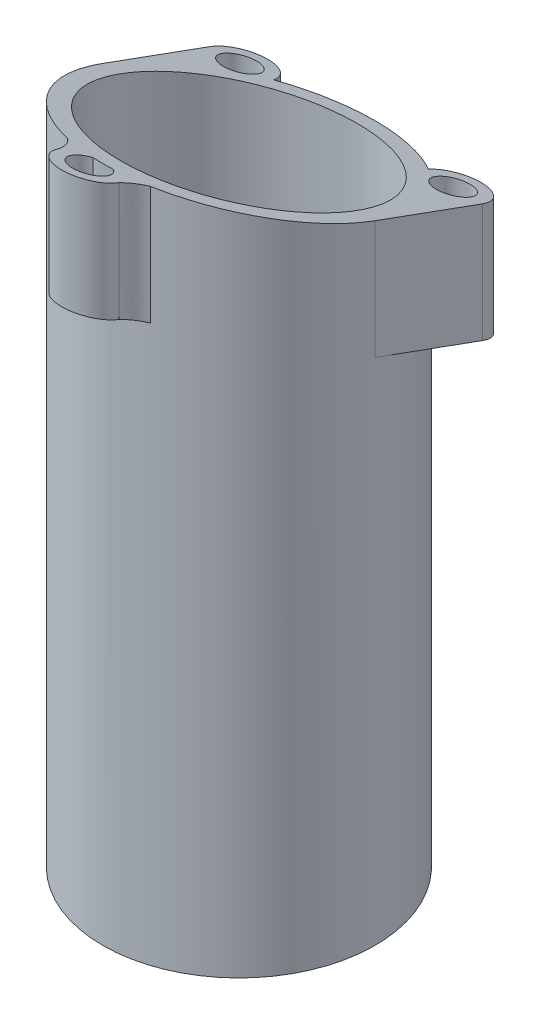
ISO-10303-21;
HEADER;
FILE_DESCRIPTION(('STEP AP214'),'2;1');
FILE_NAME('part.step','',(''),(''),'','','');
FILE_SCHEMA(('AUTOMOTIVE_DESIGN { 1 0 10303 214 1 1 1 1 }'));
ENDSEC;
DATA;
#1=APPLICATION_CONTEXT('core data for automotive mechanical design processes');
#2=APPLICATION_PROTOCOL_DEFINITION('international standard','automotive_design',2000,#1);
#3=PRODUCT_CONTEXT('',#1,'mechanical');
#4=PRODUCT('Part','Part','',(#3));
#5=PRODUCT_RELATED_PRODUCT_CATEGORY('part','',(#4));
#6=PRODUCT_DEFINITION_FORMATION('','',#4);
#7=PRODUCT_DEFINITION_CONTEXT('part definition',#1,'design');
#8=PRODUCT_DEFINITION('design','',#6,#7);
#9=PRODUCT_DEFINITION_SHAPE('','',#8);
#10=(LENGTH_UNIT() NAMED_UNIT(*) SI_UNIT(.MILLI.,.METRE.));
#11=(NAMED_UNIT(*) PLANE_ANGLE_UNIT() SI_UNIT($,.RADIAN.));
#12=(NAMED_UNIT(*) SI_UNIT($,.STERADIAN.) SOLID_ANGLE_UNIT());
#13=UNCERTAINTY_MEASURE_WITH_UNIT(LENGTH_MEASURE(1.E-05),#10,'distance_accuracy_value','');
#14=(GEOMETRIC_REPRESENTATION_CONTEXT(3) GLOBAL_UNCERTAINTY_ASSIGNED_CONTEXT((#13)) GLOBAL_UNIT_ASSIGNED_CONTEXT((#10,
#11,#12)) REPRESENTATION_CONTEXT('',''));
#15=CARTESIAN_POINT('',(0.,0.,0.));
#16=DIRECTION('',(0.,0.,1.));
#17=DIRECTION('',(1.,0.,0.));
#18=AXIS2_PLACEMENT_3D('',#15,#16,#17);
#19=CARTESIAN_POINT('',(0.,-57.18,0.));
#20=DIRECTION('',(0.,1.,0.));
#21=DIRECTION('',(0.,0.,1.));
#22=AXIS2_PLACEMENT_3D('',#19,#20,#21);
#23=CYLINDRICAL_SURFACE('',#22,11.5);
#24=DIRECTION('',(0.,1.,0.));
#25=VECTOR('',#24,1.);
#26=CARTESIAN_POINT('',(-0.861512026318653,-10.0117617335204,11.467684902739));
#27=LINE('',#26,#25);
#28=CARTESIAN_POINT('',(-0.861512026318653,-10.0117617335204,11.467684902739));
#29=VERTEX_POINT('',#28);
#30=CARTESIAN_POINT('',(-0.861512026318653,-0.0117617335204157,11.467684902739));
#31=VERTEX_POINT('',#30);
#32=EDGE_CURVE('E331',#29,#31,#27,.T.);
#33=ORIENTED_EDGE('',*,*,#32,.F.);
#34=CARTESIAN_POINT('',(0.,-14.1856576940613,0.));
#35=DIRECTION('',(0.,0.93969262078591,-0.342020143325666));
#36=DIRECTION('',(0.,0.342020143325666,0.93969262078591));
#37=AXIS2_PLACEMENT_3D('',#34,#35,#36);
#38=ELLIPSE('',#37,12.238044383473,11.5);
#39=CARTESIAN_POINT('',(-3.50666135712482,-10.1993390061462,10.9523205817967));
#40=VERTEX_POINT('',#39);
#41=EDGE_CURVE('E321',#40,#29,#38,.T.);
#42=ORIENTED_EDGE('',*,*,#41,.F.);
#43=DIRECTION('',(0.,1.,0.));
#44=VECTOR('',#43,1.);
#45=CARTESIAN_POINT('',(-3.50666135712482,-10.1993390061462,10.9523205817967));
#46=LINE('',#45,#44);
#47=CARTESIAN_POINT('',(-3.50666135712482,-0.199339006146233,10.9523205817967));
#48=VERTEX_POINT('',#47);
#49=EDGE_CURVE('E259',#40,#48,#46,.T.);
#50=ORIENTED_EDGE('',*,*,#49,.T.);
#51=CARTESIAN_POINT('',(0.,-4.18565769406128,0.));
#52=DIRECTION('',(0.,-0.93969262078591,0.342020143325666));
#53=DIRECTION('',(0.,0.342020143325666,0.93969262078591));
#54=AXIS2_PLACEMENT_3D('',#51,#52,#53);
#55=ELLIPSE('',#54,12.238044383473,11.5);
#56=CARTESIAN_POINT('',(-11.5,-4.18565769406128,0.));
#57=VERTEX_POINT('',#56);
#58=EDGE_CURVE('E277',#57,#48,#55,.F.);
#59=ORIENTED_EDGE('',*,*,#58,.F.);
#60=DIRECTION('',(0.,1.,0.));
#61=VECTOR('',#60,1.);
#62=CARTESIAN_POINT('',(-11.5,-14.1856576940613,0.));
#63=LINE('',#62,#61);
#64=CARTESIAN_POINT('',(-11.5,-14.1856576940613,0.));
#65=VERTEX_POINT('',#64);
#66=EDGE_CURVE('E267',#65,#57,#63,.T.);
#67=ORIENTED_EDGE('',*,*,#66,.F.);
#68=CARTESIAN_POINT('',(0.,-14.1856576940613,0.));
#69=DIRECTION('',(0.,0.93969262078591,-0.342020143325666));
#70=DIRECTION('',(0.,0.342020143325666,0.93969262078591));
#71=AXIS2_PLACEMENT_3D('',#68,#69,#70);
#72=ELLIPSE('',#71,12.238044383473,11.5);
#73=CARTESIAN_POINT('',(-8.48621225649061,-17.0104560192602,-7.76106961299746));
#74=VERTEX_POINT('',#73);
#75=EDGE_CURVE('E251',#74,#65,#72,.T.);
#76=ORIENTED_EDGE('',*,*,#75,.F.);
#77=CARTESIAN_POINT('',(0.,-14.1856576940613,0.));
#78=DIRECTION('',(0.,0.93969262078591,-0.342020143325666));
#79=DIRECTION('',(0.,0.342020143325665,0.93969262078591));
#80=AXIS2_PLACEMENT_3D('',#77,#78,#79);
#81=ELLIPSE('',#80,12.238044383473,11.5);
#82=CARTESIAN_POINT('',(-7.57129556332708,-17.3361661185708,-8.65595075614149));
#83=VERTEX_POINT('',#82);
#84=EDGE_CURVE('E154',#74,#83,#81,.F.);
#85=ORIENTED_EDGE('',*,*,#84,.T.);
#86=CARTESIAN_POINT('',(-6.53274349604438,-17.6303867186112,-9.46431521109095));
#87=VERTEX_POINT('',#86);
#88=EDGE_CURVE('E266',#87,#83,#72,.T.);
#89=ORIENTED_EDGE('',*,*,#88,.F.);
#90=DIRECTION('',(0.,1.,0.));
#91=VECTOR('',#90,1.);
#92=CARTESIAN_POINT('',(-6.53274349604438,-17.6303867186112,-9.46431521109095));
#93=LINE('',#92,#91);
#94=CARTESIAN_POINT('',(-6.53274349604438,-7.6303867186112,-9.46431521109095));
#95=VERTEX_POINT('',#94);
#96=EDGE_CURVE('E250',#87,#95,#93,.T.);
#97=ORIENTED_EDGE('',*,*,#96,.T.);
#98=CARTESIAN_POINT('',(6.53274349604437,-7.63038671861125,-9.46431521109108));
#99=VERTEX_POINT('',#98);
#100=EDGE_CURVE('E282',#99,#95,#55,.F.);
#101=ORIENTED_EDGE('',*,*,#100,.F.);
#102=DIRECTION('',(0.,1.,0.));
#103=VECTOR('',#102,1.);
#104=CARTESIAN_POINT('',(6.53274349604431,-17.6303867186112,-9.46431521109097));
#105=LINE('',#104,#103);
#106=CARTESIAN_POINT('',(6.53274349604431,-17.6303867186112,-9.46431521109097));
#107=VERTEX_POINT('',#106);
#108=EDGE_CURVE('E176',#107,#99,#105,.T.);
#109=ORIENTED_EDGE('',*,*,#108,.F.);
#110=CARTESIAN_POINT('',(0.,-14.1856576940613,0.));
#111=DIRECTION('',(0.,0.93969262078591,-0.342020143325666));
#112=DIRECTION('',(0.,0.342020143325666,0.93969262078591));
#113=AXIS2_PLACEMENT_3D('',#110,#111,#112);
#114=ELLIPSE('',#113,12.238044383473,11.5);
#115=CARTESIAN_POINT('',(7.57129556332706,-17.3361661185708,-8.65595075614156));
#116=VERTEX_POINT('',#115);
#117=EDGE_CURVE('E167',#116,#107,#114,.T.);
#118=ORIENTED_EDGE('',*,*,#117,.F.);
#119=CARTESIAN_POINT('',(0.,-14.1856576940613,0.));
#120=DIRECTION('',(0.,0.93969262078591,-0.342020143325666));
#121=DIRECTION('',(0.,0.342020143325665,0.93969262078591));
#122=AXIS2_PLACEMENT_3D('',#119,#120,#121);
#123=ELLIPSE('',#122,12.238044383473,11.5);
#124=CARTESIAN_POINT('',(8.48621225649049,-17.0104560192603,-7.7610696129975));
#125=VERTEX_POINT('',#124);
#126=EDGE_CURVE('E145',#116,#125,#123,.F.);
#127=ORIENTED_EDGE('',*,*,#126,.T.);
#128=CARTESIAN_POINT('',(11.5,-14.1856576940613,0.));
#129=VERTEX_POINT('',#128);
#130=EDGE_CURVE('E169',#129,#125,#114,.T.);
#131=ORIENTED_EDGE('',*,*,#130,.F.);
#132=DIRECTION('',(0.,1.,0.));
#133=VECTOR('',#132,1.);
#134=CARTESIAN_POINT('',(11.5,-14.1856576940613,0.));
#135=LINE('',#134,#133);
#136=CARTESIAN_POINT('',(11.5,-4.18565769406129,0.));
#137=VERTEX_POINT('',#136);
#138=EDGE_CURVE('E189',#129,#137,#135,.T.);
#139=ORIENTED_EDGE('',*,*,#138,.T.);
#140=CARTESIAN_POINT('',(3.50666133283461,-0.199339003315591,10.9523205895738));
#141=VERTEX_POINT('',#140);
#142=EDGE_CURVE('E399',#141,#137,#55,.F.);
#143=ORIENTED_EDGE('',*,*,#142,.F.);
#144=DIRECTION('',(0.,1.,0.));
#145=VECTOR('',#144,1.);
#146=CARTESIAN_POINT('',(3.50666135712482,-10.1993390061462,10.9523205817967));
#147=LINE('',#146,#145);
#148=CARTESIAN_POINT('',(3.50666135712482,-10.1993390061462,10.9523205817967));
#149=VERTEX_POINT('',#148);
#150=EDGE_CURVE('E324',#149,#141,#147,.T.);
#151=ORIENTED_EDGE('',*,*,#150,.F.);
#152=CARTESIAN_POINT('',(0.,-14.1856576940613,0.));
#153=DIRECTION('',(0.,0.93969262078591,-0.342020143325666));
#154=DIRECTION('',(0.,0.342020143325666,0.93969262078591));
#155=AXIS2_PLACEMENT_3D('',#152,#153,#154);
#156=ELLIPSE('',#155,12.238044383473,11.5);
#157=CARTESIAN_POINT('',(0.861512026318656,-10.0117617335204,11.467684902739));
#158=VERTEX_POINT('',#157);
#159=EDGE_CURVE('E363',#158,#149,#156,.T.);
#160=ORIENTED_EDGE('',*,*,#159,.F.);
#161=DIRECTION('',(0.,1.,0.));
#162=VECTOR('',#161,1.);
#163=CARTESIAN_POINT('',(0.861512026318656,-10.0117617335204,11.467684902739));
#164=LINE('',#163,#162);
#165=CARTESIAN_POINT('',(0.861512026318656,-0.0117617335204157,11.467684902739));
#166=VERTEX_POINT('',#165);
#167=EDGE_CURVE('E327',#158,#166,#164,.T.);
#168=ORIENTED_EDGE('',*,*,#167,.T.);
#169=EDGE_CURVE('E281',#31,#166,#55,.F.);
#170=ORIENTED_EDGE('',*,*,#169,.F.);
#171=EDGE_LOOP('',(#33,#42,#50,#59,#67,#76,#85,#89,#97,#101,#109,#118,#127,#131,#139,#143,#151,
#160,#168,#170));
#172=FACE_BOUND('',#171,.T.);
#173=CARTESIAN_POINT('',(0.,-57.18,0.));
#174=DIRECTION('',(0.,1.,0.));
#175=DIRECTION('',(0.,0.,1.));
#176=AXIS2_PLACEMENT_3D('',#173,#174,#175);
#177=CIRCLE('',#176,11.5);
#178=CARTESIAN_POINT('',(0.,-57.18,11.5));
#179=VERTEX_POINT('',#178);
#180=EDGE_CURVE('E11',#179,#179,#177,.T.);
#181=ORIENTED_EDGE('',*,*,#180,.T.);
#182=EDGE_LOOP('',(#181));
#183=FACE_BOUND('',#182,.T.);
#184=ADVANCED_FACE('F43',(#172,#183),#23,.T.);
#185=CARTESIAN_POINT('',(-11.5,0.,11.5));
#186=DIRECTION('',(0.,-0.93969262078591,0.342020143325666));
#187=DIRECTION('',(0.,-0.342020143325666,-0.93969262078591));
#188=AXIS2_PLACEMENT_3D('',#185,#186,#187);
#189=PLANE('',#188);
#190=CARTESIAN_POINT('',(0.,-4.18565769406128,0.));
#191=DIRECTION('',(0.,-0.93969262078591,0.342020143325666));
#192=DIRECTION('',(0.,0.342020143325666,0.93969262078591));
#193=AXIS2_PLACEMENT_3D('',#190,#191,#192);
#194=ELLIPSE('',#193,10.6417777247591,10.);
#195=CARTESIAN_POINT('',(0.,-0.545955351399298,10.));
#196=VERTEX_POINT('',#195);
#197=EDGE_CURVE('E46',#196,#196,#194,.F.);
#198=ORIENTED_EDGE('',*,*,#197,.F.);
#199=EDGE_LOOP('',(#198));
#200=FACE_BOUND('',#199,.T.);
#201=ORIENTED_EDGE('',*,*,#58,.T.);
#202=CARTESIAN_POINT('',(-2.5,0.408212964210414,12.6215559014968));
#203=CARTESIAN_POINT('',(-2.7833443505669,0.00609744816087304,11.5167526011383));
#204=CARTESIAN_POINT('',(-3.62383132917779,-0.234518767305347,10.8556649823902));
#205=B_SPLINE_CURVE_WITH_KNOTS('',2,(#202,#203,#204),.UNSPECIFIED.,.F.,.F.,(3,3),(0.,1.),.UNSPECIFIED.);
#206=CARTESIAN_POINT('',(-2.5,0.408212964210418,12.6215559014968));
#207=VERTEX_POINT('',#206);
#208=EDGE_CURVE('E205',#207,#48,#205,.T.);
#209=ORIENTED_EDGE('',*,*,#208,.F.);
#210=CARTESIAN_POINT('',(0.,0.408212964210418,12.6215559014968));
#211=DIRECTION('',(0.,0.93969262078591,-0.342020143325666));
#212=DIRECTION('',(0.,0.342020143325666,0.93969262078591));
#213=AXIS2_PLACEMENT_3D('',#210,#211,#212);
#214=CIRCLE('',#213,2.5);
#215=CARTESIAN_POINT('',(2.5,0.408212964210418,12.6215559014968));
#216=VERTEX_POINT('',#215);
#217=EDGE_CURVE('E344',#207,#216,#214,.T.);
#218=ORIENTED_EDGE('',*,*,#217,.T.);
#219=CARTESIAN_POINT('',(2.5,0.408212964210414,12.6215559014968));
#220=CARTESIAN_POINT('',(2.78334435056691,0.00609744816087304,11.5167526011383));
#221=CARTESIAN_POINT('',(3.62383132917779,-0.234518767305347,10.8556649823902));
#222=B_SPLINE_CURVE_WITH_KNOTS('',2,(#219,#220,#221),.UNSPECIFIED.,.F.,.F.,(3,3),(0.,1.),.UNSPECIFIED.);
#223=EDGE_CURVE('E66',#216,#141,#222,.T.);
#224=ORIENTED_EDGE('',*,*,#223,.T.);
#225=ORIENTED_EDGE('',*,*,#142,.T.);
#226=DIRECTION('',(0.,0.342020143325666,0.93969262078591));
#227=VECTOR('',#226,1.);
#228=CARTESIAN_POINT('',(11.5,-3.69602875569757,1.34524445206585));
#229=LINE('',#228,#227);
#230=CARTESIAN_POINT('',(11.5,-7.49245234661246,-9.08534363865775));
#231=VERTEX_POINT('',#230);
#232=EDGE_CURVE('E181',#231,#137,#229,.T.);
#233=ORIENTED_EDGE('',*,*,#232,.F.);
#234=CARTESIAN_POINT('',(9.,-7.49245234661246,-9.08534363865775));
#235=DIRECTION('',(0.,0.93969262078591,-0.342020143325666));
#236=DIRECTION('',(0.,0.342020143325666,0.93969262078591));
#237=AXIS2_PLACEMENT_3D('',#234,#235,#236);
#238=CIRCLE('',#237,2.5);
#239=EDGE_CURVE('E59',#99,#231,#238,.F.);
#240=ORIENTED_EDGE('',*,*,#239,.F.);
#241=ORIENTED_EDGE('',*,*,#100,.T.);
#242=CARTESIAN_POINT('',(-9.,-7.49245234661246,-9.08534363865775));
#243=DIRECTION('',(0.,0.93969262078591,-0.342020143325666));
#244=DIRECTION('',(0.,0.342020143325666,0.93969262078591));
#245=AXIS2_PLACEMENT_3D('',#242,#243,#244);
#246=CIRCLE('',#245,2.5);
#247=CARTESIAN_POINT('',(-11.5,-7.49245234661246,-9.08534363865775));
#248=VERTEX_POINT('',#247);
#249=EDGE_CURVE('E254',#95,#248,#246,.T.);
#250=ORIENTED_EDGE('',*,*,#249,.T.);
#251=DIRECTION('',(0.,0.342020143325666,0.93969262078591));
#252=VECTOR('',#251,1.);
#253=CARTESIAN_POINT('',(-11.5,-3.69602875569757,1.34524445206585));
#254=LINE('',#253,#252);
#255=EDGE_CURVE('E258',#248,#57,#254,.T.);
#256=ORIENTED_EDGE('',*,*,#255,.T.);
#257=EDGE_LOOP('',(#201,#209,#218,#224,#225,#233,#240,#241,#250,#256));
#258=FACE_BOUND('',#257,.T.);
#259=CARTESIAN_POINT('',(-9.,-7.49245234661246,-9.08534363865775));
#260=DIRECTION('',(0.,0.93969262078591,-0.342020143325666));
#261=DIRECTION('',(0.,0.342020143325666,0.93969262078591));
#262=AXIS2_PLACEMENT_3D('',#259,#260,#261);
#263=CIRCLE('',#262,1.5);
#264=CARTESIAN_POINT('',(-9.,-6.97942213162396,-7.67580470747888));
#265=VERTEX_POINT('',#264);
#266=EDGE_CURVE('E262',#265,#265,#263,.T.);
#267=ORIENTED_EDGE('',*,*,#266,.F.);
#268=EDGE_LOOP('',(#267));
#269=FACE_BOUND('',#268,.T.);
#270=CARTESIAN_POINT('',(0.,0.408212964210418,12.6215559014968));
#271=DIRECTION('',(0.,0.93969262078591,-0.342020143325666));
#272=DIRECTION('',(0.,0.342020143325666,0.93969262078591));
#273=AXIS2_PLACEMENT_3D('',#270,#271,#272);
#274=CIRCLE('',#273,1.5);
#275=EDGE_CURVE('E216',#31,#166,#274,.T.);
#276=ORIENTED_EDGE('',*,*,#275,.F.);
#277=ORIENTED_EDGE('',*,*,#169,.T.);
#278=EDGE_LOOP('',(#276,#277));
#279=FACE_BOUND('',#278,.T.);
#280=CARTESIAN_POINT('',(9.,-7.49245234661246,-9.08534363865775));
#281=DIRECTION('',(0.,0.93969262078591,-0.342020143325666));
#282=DIRECTION('',(0.,0.342020143325666,0.93969262078591));
#283=AXIS2_PLACEMENT_3D('',#280,#281,#282);
#284=CIRCLE('',#283,1.5);
#285=CARTESIAN_POINT('',(9.,-6.97942213162396,-7.67580470747888));
#286=VERTEX_POINT('',#285);
#287=EDGE_CURVE('E195',#286,#286,#284,.F.);
#288=ORIENTED_EDGE('',*,*,#287,.T.);
#289=EDGE_LOOP('',(#288));
#290=FACE_BOUND('',#289,.T.);
#291=ADVANCED_FACE('F296',(#200,#258,#269,#279,#290),#189,.F.);
#292=CARTESIAN_POINT('',(0.,-57.18,0.));
#293=DIRECTION('',(0.,1.,0.));
#294=DIRECTION('',(0.,0.,1.));
#295=AXIS2_PLACEMENT_3D('',#292,#293,#294);
#296=PLANE('',#295);
#297=CARTESIAN_POINT('',(0.,-57.18,0.));
#298=DIRECTION('',(0.,1.,0.));
#299=DIRECTION('',(0.,0.,1.));
#300=AXIS2_PLACEMENT_3D('',#297,#298,#299);
#301=CIRCLE('',#300,10.);
#302=CARTESIAN_POINT('',(0.,-57.18,10.));
#303=VERTEX_POINT('',#302);
#304=EDGE_CURVE('E52',#303,#303,#301,.T.);
#305=ORIENTED_EDGE('',*,*,#304,.T.);
#306=EDGE_LOOP('',(#305));
#307=FACE_BOUND('',#306,.T.);
#308=ORIENTED_EDGE('',*,*,#180,.F.);
#309=EDGE_LOOP('',(#308));
#310=FACE_BOUND('',#309,.T.);
#311=ADVANCED_FACE('F287',(#307,#310),#296,.F.);
#312=CARTESIAN_POINT('',(0.,-57.18,0.));
#313=DIRECTION('',(0.,1.,0.));
#314=DIRECTION('',(0.,0.,1.));
#315=AXIS2_PLACEMENT_3D('',#312,#313,#314);
#316=CYLINDRICAL_SURFACE('',#315,10.);
#317=ORIENTED_EDGE('',*,*,#197,.T.);
#318=EDGE_LOOP('',(#317));
#319=FACE_BOUND('',#318,.T.);
#320=ORIENTED_EDGE('',*,*,#304,.F.);
#321=EDGE_LOOP('',(#320));
#322=FACE_BOUND('',#321,.T.);
#323=ADVANCED_FACE('F241',(#319,#322),#316,.F.);
#324=CARTESIAN_POINT('',(-9.,-17.4924523466125,-9.08534363865775));
#325=DIRECTION('',(0.,0.93969262078591,-0.342020143325666));
#326=DIRECTION('',(0.,0.342020143325666,0.93969262078591));
#327=AXIS2_PLACEMENT_3D('',#324,#325,#326);
#328=CIRCLE('',#327,1.5);
#329=DIRECTION('',(0.,1.,0.));
#330=VECTOR('',#329,1.);
#331=SURFACE_OF_LINEAR_EXTRUSION('',#328,#330);
#332=ORIENTED_EDGE('',*,*,#266,.T.);
#333=EDGE_LOOP('',(#332));
#334=FACE_BOUND('',#333,.T.);
#335=CARTESIAN_POINT('',(-9.,-16.979422131624,-7.67580470747888));
#336=CARTESIAN_POINT('',(-9.04142375004016,-16.979421543531,-7.67580309170664));
#337=CARTESIAN_POINT('',(-9.08283578735052,-16.9800081102981,-7.67741467065445));
#338=CARTESIAN_POINT('',(-9.20692482774612,-16.9835350284742,-7.68710479870336));
#339=CARTESIAN_POINT('',(-9.2892371276089,-16.9882487325983,-7.70005559434632));
#340=CARTESIAN_POINT('',(-9.45039894430887,-17.0022687298079,-7.73857522010049));
#341=CARTESIAN_POINT('',(-9.52924846114607,-17.0115750228933,-7.76414405021169));
#342=CARTESIAN_POINT('',(-9.68136932207391,-17.0345230289055,-7.82719317855168));
#343=CARTESIAN_POINT('',(-9.75464066616455,-17.0481647418322,-7.86467347678046));
#344=CARTESIAN_POINT('',(-9.89356834570641,-17.079407461562,-7.9505121437604));
#345=CARTESIAN_POINT('',(-9.95922468115764,-17.0970084683651,-7.99887051251157));
#346=CARTESIAN_POINT('',(-10.0811157163161,-17.1356842810727,-8.10513143460474));
#347=CARTESIAN_POINT('',(-10.1373504160234,-17.1567590869772,-8.16303398794674));
#348=CARTESIAN_POINT('',(-10.2388460078203,-17.2018012355239,-8.28678627400264));
#349=CARTESIAN_POINT('',(-10.2841068999098,-17.2257685781662,-8.35263600671652));
#350=CARTESIAN_POINT('',(-10.3624068257236,-17.275934745807,-8.49046641953032));
#351=CARTESIAN_POINT('',(-10.3954458594479,-17.3021335708056,-8.56244709963023));
#352=CARTESIAN_POINT('',(-10.4483907250828,-17.3560401046593,-8.71055408415437));
#353=CARTESIAN_POINT('',(-10.4682965569934,-17.3837478135144,-8.7866803885786));
#354=CARTESIAN_POINT('',(-10.4944260111011,-17.439907898659,-8.94097895438793));
#355=CARTESIAN_POINT('',(-10.500649633298,-17.4683602749485,-9.01915121577302));
#356=CARTESIAN_POINT('',(-10.4992430061363,-17.5252249398298,-9.17538559849931));
#357=CARTESIAN_POINT('',(-10.4916127567776,-17.5536372284217,-9.25344771984051));
#358=CARTESIAN_POINT('',(-10.4627088407229,-17.6096380683876,-9.40730876311732));
#359=CARTESIAN_POINT('',(-10.4414351740268,-17.6372266197616,-9.48310768505294));
#360=CARTESIAN_POINT('',(-10.3858311794946,-17.6908190555793,-9.63035169231553));
#361=CARTESIAN_POINT('',(-10.3515008516584,-17.7168229400229,-9.7017967776425));
#362=CARTESIAN_POINT('',(-10.2707304120265,-17.7665288195289,-9.83836255919941));
#363=CARTESIAN_POINT('',(-10.2242903002307,-17.7902308145913,-9.90348325542934));
#364=CARTESIAN_POINT('',(-10.1205811740047,-17.8346791821206,-10.0256041415477));
#365=CARTESIAN_POINT('',(-10.0633121595745,-17.8554255545875,-10.0826043314361));
#366=CARTESIAN_POINT('',(-9.93952478528515,-17.8933904637966,-10.1869120622199));
#367=CARTESIAN_POINT('',(-9.87300642542604,-17.9106090005389,-10.2342196031152));
#368=CARTESIAN_POINT('',(-9.732555026983,-17.9410433276701,-10.3178372296846));
#369=CARTESIAN_POINT('',(-9.65862198839906,-17.9542591180591,-10.3541473153587));
#370=CARTESIAN_POINT('',(-9.50538040612261,-17.9763234430361,-10.4147685500084));
#371=CARTESIAN_POINT('',(-9.42607186243009,-17.985171977624,-10.439079698984));
#372=CARTESIAN_POINT('',(-9.26426670728356,-17.9982577363973,-10.4750325257301));
#373=CARTESIAN_POINT('',(-9.18177009582956,-18.0024949605827,-10.4866742035006));
#374=CARTESIAN_POINT('',(-9.01586417374605,-18.0062412301531,-10.4969669945526));
#375=CARTESIAN_POINT('',(-8.93245486311654,-18.0057502755382,-10.495618107834));
#376=CARTESIAN_POINT('',(-8.76702408475085,-18.000053728703,-10.4799669740354));
#377=CARTESIAN_POINT('',(-8.68500261701465,-17.9948481364828,-10.4656647269555));
#378=CARTESIAN_POINT('',(-8.52460978791239,-17.9798658917404,-10.424501347833));
#379=CARTESIAN_POINT('',(-8.44623842654631,-17.9700892392182,-10.3976402157906));
#380=CARTESIAN_POINT('',(-8.29530739877055,-17.9462345272267,-10.3320999332461));
#381=CARTESIAN_POINT('',(-8.22274773236085,-17.9321564677572,-10.2934207827441));
#382=CARTESIAN_POINT('',(-8.08544138864219,-17.9000872338713,-10.2053112867833));
#383=CARTESIAN_POINT('',(-8.02069471133322,-17.8820960594548,-10.1558809413245));
#384=CARTESIAN_POINT('',(-7.90080014711699,-17.8426968166995,-10.0476324115107));
#385=CARTESIAN_POINT('',(-7.84565226020972,-17.8212887483607,-9.98881422715573));
#386=CARTESIAN_POINT('',(-7.74647633039531,-17.7756461813614,-9.86341230495922));
#387=CARTESIAN_POINT('',(-7.70244828748815,-17.7514116827009,-9.79682856711766));
#388=CARTESIAN_POINT('',(-7.62672639897244,-17.7007846754429,-9.65773200786179));
#389=CARTESIAN_POINT('',(-7.59503255336388,-17.6743921668454,-9.58521918644748));
#390=CARTESIAN_POINT('',(-7.5448532184579,-17.6201770809535,-9.43626446216553));
#391=CARTESIAN_POINT('',(-7.52636772916049,-17.592354503659,-9.35982255929788));
#392=CARTESIAN_POINT('',(-7.50311496287493,-17.5360466648117,-9.20511804352659));
#393=CARTESIAN_POINT('',(-7.49834768588678,-17.5075614032588,-9.12685543062293));
#394=CARTESIAN_POINT('',(-7.50266282809821,-17.4507138582078,-8.97066808424374));
#395=CARTESIAN_POINT('',(-7.51174524729778,-17.4223515747096,-8.8927433507682));
#396=CARTESIAN_POINT('',(-7.5435092917126,-17.3665322556475,-8.73938103207575));
#397=CARTESIAN_POINT('',(-7.56619091692786,-17.3390752200836,-8.66394344685884));
#398=CARTESIAN_POINT('',(-7.62452772630248,-17.2858237007858,-8.51763610003642));
#399=CARTESIAN_POINT('',(-7.66018291046185,-17.2600292170518,-8.44676633843091));
#400=CARTESIAN_POINT('',(-7.74348363220922,-17.2108142424701,-8.31154930706873));
#401=CARTESIAN_POINT('',(-7.79112916979722,-17.1873937516224,-8.24720203731207));
#402=CARTESIAN_POINT('',(-7.89709567525545,-17.1435727535455,-8.12680483459769));
#403=CARTESIAN_POINT('',(-7.95541664312567,-17.1231722463163,-8.07075490163998));
#404=CARTESIAN_POINT('',(-8.08112840279938,-17.0859538078647,-7.96849808240688));
#405=CARTESIAN_POINT('',(-8.14851919460285,-17.0691358766423,-7.92229119613148));
#406=CARTESIAN_POINT('',(-8.29050080647727,-17.0395467550335,-7.84099575264979));
#407=CARTESIAN_POINT('',(-8.36509162654821,-17.0267755646471,-7.80590719544348));
#408=CARTESIAN_POINT('',(-8.51945727808861,-17.0056310390145,-7.74781308872302));
#409=CARTESIAN_POINT('',(-8.59923210955808,-16.9972577037684,-7.72480753920886));
#410=CARTESIAN_POINT('',(-8.73288992964959,-16.9872867075319,-7.69741245219944));
#411=CARTESIAN_POINT('',(-8.78594898574783,-16.9843399768442,-7.68931637617378));
#412=CARTESIAN_POINT('',(-8.89267880173857,-16.9804085860585,-7.67851496876305));
#413=CARTESIAN_POINT('',(-8.94634922470992,-16.9794228933041,-7.67580680017772));
#414=CARTESIAN_POINT('',(-9.,-16.979422131624,-7.67580470747888));
#415=B_SPLINE_CURVE_WITH_KNOTS('',3,(#335,#336,#337,#338,#339,#340,#341,#342,#343,#344,#345,
#346,#347,#348,#349,#350,#351,#352,#353,#354,#355,#356,#357,#358,#359,#360,#361,#362,#363,#364,
#365,#366,#367,#368,#369,#370,#371,#372,#373,#374,#375,#376,#377,#378,#379,#380,#381,#382,#383,
#384,#385,#386,#387,#388,#389,#390,#391,#392,#393,#394,#395,#396,#397,#398,#399,#400,#401,#402,
#403,#404,#405,#406,#407,#408,#409,#410,#411,#412,#413,#414),.UNSPECIFIED.,.T.,.F.,(4,2,2,2,2,2,
2,2,2,2,2,2,2,2,2,2,2,2,2,2,2,2,2,2,2,2,2,2,2,2,2,2,2,2,2,2,2,2,2,4),(0.,0.124233665811327,
0.373348209381058,0.62246275295079,0.871577296520524,1.12069184009026,1.36980638365999,
1.61892092722972,1.86803547079945,2.11715001436919,2.36626455793892,2.61537910150865,
2.86449364507838,3.11360818864812,3.36272273221785,3.61183727578758,3.86095181935731,
4.11006636292704,4.35918090649677,4.6082954500665,4.85740999363624,5.10652453720597,
5.3556390807757,5.60475362434543,5.85386816791516,6.10298271148489,6.35209725505462,
6.60121179862436,6.85032634219409,7.09944088576382,7.34855542933355,7.59766997290328,
7.84678451647301,8.09589906004274,8.34501360361247,8.59412814718221,8.84324269075194,
9.09235723432167,9.25334567897474,9.41424932679619),.UNSPECIFIED.);
#416=EDGE_CURVE('E155',#83,#74,#415,.T.);
#417=ORIENTED_EDGE('',*,*,#416,.T.);
#418=EDGE_CURVE('E244',#83,#74,#328,.T.);
#419=ORIENTED_EDGE('',*,*,#418,.F.);
#420=EDGE_LOOP('',(#417,#419));
#421=FACE_BOUND('',#420,.T.);
#422=ADVANCED_FACE('F236',(#334,#421),#331,.F.);
#423=CARTESIAN_POINT('',(-11.5,-13.6960287556976,1.34524445206585));
#424=DIRECTION('',(-1.,0.,0.));
#425=DIRECTION('',(0.,0.,1.));
#426=AXIS2_PLACEMENT_3D('',#423,#424,#425);
#427=PLANE('',#426);
#428=ORIENTED_EDGE('',*,*,#255,.F.);
#429=DIRECTION('',(0.,1.,0.));
#430=VECTOR('',#429,1.);
#431=CARTESIAN_POINT('',(-11.5,-17.4924523466125,-9.08534363865775));
#432=LINE('',#431,#430);
#433=CARTESIAN_POINT('',(-11.5,-17.4924523466125,-9.08534363865775));
#434=VERTEX_POINT('',#433);
#435=EDGE_CURVE('E271',#434,#248,#432,.T.);
#436=ORIENTED_EDGE('',*,*,#435,.F.);
#437=DIRECTION('',(0.,0.342020143325666,0.93969262078591));
#438=VECTOR('',#437,1.);
#439=CARTESIAN_POINT('',(-11.5,-13.6960287556976,1.34524445206585));
#440=LINE('',#439,#438);
#441=EDGE_CURVE('E252',#434,#65,#440,.T.);
#442=ORIENTED_EDGE('',*,*,#441,.T.);
#443=ORIENTED_EDGE('',*,*,#66,.T.);
#444=EDGE_LOOP('',(#428,#436,#442,#443));
#445=FACE_BOUND('',#444,.T.);
#446=ADVANCED_FACE('F240',(#445),#427,.T.);
#447=CARTESIAN_POINT('',(-9.,-17.4924523466125,-9.08534363865775));
#448=DIRECTION('',(0.,0.93969262078591,-0.342020143325666));
#449=DIRECTION('',(0.,0.342020143325666,0.93969262078591));
#450=AXIS2_PLACEMENT_3D('',#447,#448,#449);
#451=CIRCLE('',#450,2.5);
#452=DIRECTION('',(0.,1.,0.));
#453=VECTOR('',#452,1.);
#454=SURFACE_OF_LINEAR_EXTRUSION('',#451,#453);
#455=ORIENTED_EDGE('',*,*,#249,.F.);
#456=ORIENTED_EDGE('',*,*,#96,.F.);
#457=EDGE_CURVE('E309',#87,#434,#451,.T.);
#458=ORIENTED_EDGE('',*,*,#457,.T.);
#459=ORIENTED_EDGE('',*,*,#435,.T.);
#460=EDGE_LOOP('',(#455,#456,#458,#459));
#461=FACE_BOUND('',#460,.T.);
#462=ADVANCED_FACE('F234',(#461),#454,.T.);
#463=CARTESIAN_POINT('',(0.,-13.6960287556976,1.34524445206585));
#464=DIRECTION('',(0.,0.93969262078591,-0.342020143325666));
#465=DIRECTION('',(0.,0.342020143325666,0.93969262078591));
#466=AXIS2_PLACEMENT_3D('',#463,#464,#465);
#467=PLANE('',#466);
#468=ORIENTED_EDGE('',*,*,#88,.T.);
#469=ORIENTED_EDGE('',*,*,#418,.T.);
#470=ORIENTED_EDGE('',*,*,#75,.T.);
#471=ORIENTED_EDGE('',*,*,#441,.F.);
#472=ORIENTED_EDGE('',*,*,#457,.F.);
#473=EDGE_LOOP('',(#468,#469,#470,#471,#472));
#474=FACE_BOUND('',#473,.T.);
#475=ADVANCED_FACE('F228',(#474),#467,.F.);
#476=CARTESIAN_POINT('',(-2.5,-9.59178703578959,12.6215559014968));
#477=CARTESIAN_POINT('',(-2.7833443505669,-9.99390255183913,11.5167526011383));
#478=CARTESIAN_POINT('',(-3.62383132917779,-10.2345187673053,10.8556649823902));
#479=B_SPLINE_CURVE_WITH_KNOTS('',2,(#476,#477,#478),.UNSPECIFIED.,.F.,.F.,(3,3),(0.,1.),.UNSPECIFIED.);
#480=DIRECTION('',(0.,1.,0.));
#481=VECTOR('',#480,1.);
#482=SURFACE_OF_LINEAR_EXTRUSION('',#479,#481);
#483=ORIENTED_EDGE('',*,*,#208,.T.);
#484=ORIENTED_EDGE('',*,*,#49,.F.);
#485=CARTESIAN_POINT('',(-2.5,-9.59178703578958,12.6215559014968));
#486=VERTEX_POINT('',#485);
#487=EDGE_CURVE('E209',#486,#40,#479,.T.);
#488=ORIENTED_EDGE('',*,*,#487,.F.);
#489=DIRECTION('',(0.,1.,0.));
#490=VECTOR('',#489,1.);
#491=CARTESIAN_POINT('',(-2.5,-9.59178703578958,12.6215559014968));
#492=LINE('',#491,#490);
#493=EDGE_CURVE('E317',#486,#207,#492,.T.);
#494=ORIENTED_EDGE('',*,*,#493,.T.);
#495=EDGE_LOOP('',(#483,#484,#488,#494));
#496=FACE_BOUND('',#495,.T.);
#497=ADVANCED_FACE('F223',(#496),#482,.F.);
#498=CARTESIAN_POINT('',(0.,-9.59178703578958,12.6215559014968));
#499=DIRECTION('',(0.,0.93969262078591,-0.342020143325666));
#500=DIRECTION('',(0.,0.342020143325666,0.93969262078591));
#501=AXIS2_PLACEMENT_3D('',#498,#499,#500);
#502=CIRCLE('',#501,1.5);
#503=DIRECTION('',(0.,1.,0.));
#504=VECTOR('',#503,1.);
#505=SURFACE_OF_LINEAR_EXTRUSION('',#502,#504);
#506=ORIENTED_EDGE('',*,*,#275,.T.);
#507=ORIENTED_EDGE('',*,*,#167,.F.);
#508=EDGE_CURVE('E359',#29,#158,#502,.T.);
#509=ORIENTED_EDGE('',*,*,#508,.F.);
#510=ORIENTED_EDGE('',*,*,#32,.T.);
#511=EDGE_LOOP('',(#506,#507,#509,#510));
#512=FACE_BOUND('',#511,.T.);
#513=ADVANCED_FACE('F227',(#512),#505,.F.);
#514=CARTESIAN_POINT('',(2.5,-9.59178703578959,12.6215559014968));
#515=CARTESIAN_POINT('',(2.78334435056691,-9.99390255183913,11.5167526011383));
#516=CARTESIAN_POINT('',(3.62383132917779,-10.2345187673053,10.8556649823902));
#517=B_SPLINE_CURVE_WITH_KNOTS('',2,(#514,#515,#516),.UNSPECIFIED.,.F.,.F.,(3,3),(0.,1.),.UNSPECIFIED.);
#518=DIRECTION('',(0.,1.,0.));
#519=VECTOR('',#518,1.);
#520=SURFACE_OF_LINEAR_EXTRUSION('',#517,#519);
#521=ORIENTED_EDGE('',*,*,#223,.F.);
#522=DIRECTION('',(0.,1.,0.));
#523=VECTOR('',#522,1.);
#524=CARTESIAN_POINT('',(2.5,-9.59178703578958,12.6215559014968));
#525=LINE('',#524,#523);
#526=CARTESIAN_POINT('',(2.5,-9.59178703578958,12.6215559014968));
#527=VERTEX_POINT('',#526);
#528=EDGE_CURVE('E320',#527,#216,#525,.T.);
#529=ORIENTED_EDGE('',*,*,#528,.F.);
#530=EDGE_CURVE('E373',#527,#149,#517,.T.);
#531=ORIENTED_EDGE('',*,*,#530,.T.);
#532=ORIENTED_EDGE('',*,*,#150,.T.);
#533=EDGE_LOOP('',(#521,#529,#531,#532));
#534=FACE_BOUND('',#533,.T.);
#535=ADVANCED_FACE('F367',(#534),#520,.T.);
#536=CARTESIAN_POINT('',(0.,-9.59178703578958,12.6215559014968));
#537=DIRECTION('',(0.,0.93969262078591,-0.342020143325666));
#538=DIRECTION('',(0.,0.342020143325666,0.93969262078591));
#539=AXIS2_PLACEMENT_3D('',#536,#537,#538);
#540=CIRCLE('',#539,2.5);
#541=DIRECTION('',(0.,1.,0.));
#542=VECTOR('',#541,1.);
#543=SURFACE_OF_LINEAR_EXTRUSION('',#540,#542);
#544=ORIENTED_EDGE('',*,*,#217,.F.);
#545=ORIENTED_EDGE('',*,*,#493,.F.);
#546=EDGE_CURVE('E215',#486,#527,#540,.T.);
#547=ORIENTED_EDGE('',*,*,#546,.T.);
#548=ORIENTED_EDGE('',*,*,#528,.T.);
#549=EDGE_LOOP('',(#544,#545,#547,#548));
#550=FACE_BOUND('',#549,.T.);
#551=ADVANCED_FACE('F230',(#550),#543,.T.);
#552=CARTESIAN_POINT('',(0.,-13.6960287556976,1.34524445206585));
#553=DIRECTION('',(0.,0.93969262078591,-0.342020143325666));
#554=DIRECTION('',(0.,0.342020143325666,0.93969262078591));
#555=AXIS2_PLACEMENT_3D('',#552,#553,#554);
#556=PLANE('',#555);
#557=ORIENTED_EDGE('',*,*,#487,.T.);
#558=ORIENTED_EDGE('',*,*,#41,.T.);
#559=ORIENTED_EDGE('',*,*,#508,.T.);
#560=ORIENTED_EDGE('',*,*,#159,.T.);
#561=ORIENTED_EDGE('',*,*,#530,.F.);
#562=ORIENTED_EDGE('',*,*,#546,.F.);
#563=EDGE_LOOP('',(#557,#558,#559,#560,#561,#562));
#564=FACE_BOUND('',#563,.T.);
#565=ADVANCED_FACE('F369',(#564),#556,.F.);
#566=CARTESIAN_POINT('',(9.,-17.4924523466125,-9.08534363865775));
#567=DIRECTION('',(0.,0.93969262078591,-0.342020143325666));
#568=DIRECTION('',(0.,0.342020143325666,0.93969262078591));
#569=AXIS2_PLACEMENT_3D('',#566,#567,#568);
#570=CIRCLE('',#569,2.5);
#571=DIRECTION('',(0.,1.,0.));
#572=VECTOR('',#571,1.);
#573=SURFACE_OF_LINEAR_EXTRUSION('',#570,#572);
#574=ORIENTED_EDGE('',*,*,#239,.T.);
#575=DIRECTION('',(0.,1.,0.));
#576=VECTOR('',#575,1.);
#577=CARTESIAN_POINT('',(11.5,-17.4924523466125,-9.08534363865775));
#578=LINE('',#577,#576);
#579=CARTESIAN_POINT('',(11.5,-17.4924523466125,-9.08534363865775));
#580=VERTEX_POINT('',#579);
#581=EDGE_CURVE('E201',#580,#231,#578,.T.);
#582=ORIENTED_EDGE('',*,*,#581,.F.);
#583=EDGE_CURVE('E178',#107,#580,#570,.F.);
#584=ORIENTED_EDGE('',*,*,#583,.F.);
#585=ORIENTED_EDGE('',*,*,#108,.T.);
#586=EDGE_LOOP('',(#574,#582,#584,#585));
#587=FACE_BOUND('',#586,.T.);
#588=ADVANCED_FACE('F458',(#587),#573,.T.);
#589=CARTESIAN_POINT('',(11.5,-13.6960287556976,1.34524445206585));
#590=DIRECTION('',(-1.,0.,0.));
#591=DIRECTION('',(0.,0.,1.));
#592=AXIS2_PLACEMENT_3D('',#589,#590,#591);
#593=PLANE('',#592);
#594=ORIENTED_EDGE('',*,*,#232,.T.);
#595=ORIENTED_EDGE('',*,*,#138,.F.);
#596=DIRECTION('',(0.,0.342020143325666,0.93969262078591));
#597=VECTOR('',#596,1.);
#598=CARTESIAN_POINT('',(11.5,-13.6960287556976,1.34524445206585));
#599=LINE('',#598,#597);
#600=EDGE_CURVE('E184',#580,#129,#599,.T.);
#601=ORIENTED_EDGE('',*,*,#600,.F.);
#602=ORIENTED_EDGE('',*,*,#581,.T.);
#603=EDGE_LOOP('',(#594,#595,#601,#602));
#604=FACE_BOUND('',#603,.T.);
#605=ADVANCED_FACE('F461',(#604),#593,.F.);
#606=CARTESIAN_POINT('',(9.,-17.4924523466125,-9.08534363865775));
#607=DIRECTION('',(0.,0.93969262078591,-0.342020143325666));
#608=DIRECTION('',(0.,0.342020143325666,0.93969262078591));
#609=AXIS2_PLACEMENT_3D('',#606,#607,#608);
#610=CIRCLE('',#609,1.5);
#611=DIRECTION('',(0.,1.,0.));
#612=VECTOR('',#611,1.);
#613=SURFACE_OF_LINEAR_EXTRUSION('',#610,#612);
#614=ORIENTED_EDGE('',*,*,#287,.F.);
#615=EDGE_LOOP('',(#614));
#616=FACE_BOUND('',#615,.T.);
#617=CARTESIAN_POINT('',(9.,-16.979422131624,-7.67580470747888));
#618=CARTESIAN_POINT('',(9.08308319548595,-16.9794235198673,-7.67580852164611));
#619=CARTESIAN_POINT('',(9.16625361412011,-16.9817917397439,-7.68231515228133));
#620=CARTESIAN_POINT('',(9.33025477232342,-16.991202593601,-7.70817126075141));
#621=CARTESIAN_POINT('',(9.41108551189257,-16.9982452275814,-7.72752073858627));
#622=CARTESIAN_POINT('',(9.56823688536781,-17.0168090379031,-7.77852438826401));
#623=CARTESIAN_POINT('',(9.64455751927389,-17.0283302142442,-7.81017856010687));
#624=CARTESIAN_POINT('',(9.79056784702871,-17.055533775371,-7.88491973003137));
#625=CARTESIAN_POINT('',(9.86025754087745,-17.0712161601566,-7.92800672811301));
#626=CARTESIAN_POINT('',(9.99108808776169,-17.1063094799355,-8.02442483177923));
#627=CARTESIAN_POINT('',(10.0522289407972,-17.1257204149288,-8.07775593736382));
#628=CARTESIAN_POINT('',(10.1642743233516,-17.1677354864604,-8.19319139767367));
#629=CARTESIAN_POINT('',(10.2151788528706,-17.1903396229987,-8.25529575239893));
#630=CARTESIAN_POINT('',(10.3053478764381,-17.2381176364516,-8.38656476550715));
#631=CARTESIAN_POINT('',(10.3446123704867,-17.2632915133662,-8.45572942389011));
#632=CARTESIAN_POINT('',(10.410418273556,-17.3155146801029,-8.59921139527185));
#633=CARTESIAN_POINT('',(10.4369596825767,-17.3425639699251,-8.67352870827064));
#634=CARTESIAN_POINT('',(10.4765873893163,-17.3977919057252,-8.82526621480443));
#635=CARTESIAN_POINT('',(10.4896736870352,-17.4259705517031,-8.90268640833943));
#636=CARTESIAN_POINT('',(10.5020302274567,-17.4826799946491,-9.05849432230348));
#637=CARTESIAN_POINT('',(10.5013004701593,-17.5112107916173,-9.13688204273253));
#638=CARTESIAN_POINT('',(10.4860450298131,-17.5678376183714,-9.29246297057493));
#639=CARTESIAN_POINT('',(10.4715193467644,-17.5959336481574,-9.36965617798828));
#640=CARTESIAN_POINT('',(10.429072692562,-17.6509160138989,-9.52071898633133));
#641=CARTESIAN_POINT('',(10.4011517214083,-17.6778023498545,-9.59458858726103));
#642=CARTESIAN_POINT('',(10.3326845894135,-17.7296237662709,-9.73696675870929));
#643=CARTESIAN_POINT('',(10.2921384285725,-17.7545588467318,-9.80547532922783));
#644=CARTESIAN_POINT('',(10.1995392353563,-17.8017900087752,-9.93524188043682));
#645=CARTESIAN_POINT('',(10.1474862029811,-17.8240860903578,-9.99649986112727));
#646=CARTESIAN_POINT('',(10.033308960033,-17.8654242984332,-10.110075654375));
#647=CARTESIAN_POINT('',(9.97118474946015,-17.8844664249259,-10.1623934669323));
#648=CARTESIAN_POINT('',(9.83857862021549,-17.9187715151112,-10.2566459275886));
#649=CARTESIAN_POINT('',(9.76809670154373,-17.9340344788036,-10.2985805756876));
#650=CARTESIAN_POINT('',(9.62071914314332,-17.9603602701203,-10.3709100928795));
#651=CARTESIAN_POINT('',(9.54382350341467,-17.9714230977446,-10.4013049619724));
#652=CARTESIAN_POINT('',(9.38573938907916,-17.9890434891141,-10.4497165893821));
#653=CARTESIAN_POINT('',(9.30455091447232,-17.9956010528593,-10.4677333476988));
#654=CARTESIAN_POINT('',(9.14012041877555,-18.0040300499567,-10.4908918268924));
#655=CARTESIAN_POINT('',(9.05687839768562,-18.0059014833087,-10.4960335477692));
#656=CARTESIAN_POINT('',(8.89063673701878,-18.0049066029462,-10.4933001364381));
#657=CARTESIAN_POINT('',(8.80763709744186,-18.0020402892316,-10.4854250042301));
#658=CARTESIAN_POINT('',(8.6441694425858,-17.9916489715608,-10.4568750935712));
#659=CARTESIAN_POINT('',(8.56370142730665,-17.9841239676046,-10.4362003151202));
#660=CARTESIAN_POINT('',(8.40751643819449,-17.9646228192797,-10.3826213504442));
#661=CARTESIAN_POINT('',(8.33179946436147,-17.952646674911,-10.3497171642192));
#662=CARTESIAN_POINT('',(8.18720493511415,-17.9245735640882,-10.2725869261397));
#663=CARTESIAN_POINT('',(8.11832737969986,-17.9084765976341,-10.2283608742853));
#664=CARTESIAN_POINT('',(7.98931142381402,-17.8726058188371,-10.1298067195222));
#665=CARTESIAN_POINT('',(7.92917302334246,-17.8528320064942,-10.0754786166137));
#666=CARTESIAN_POINT('',(7.81929407610267,-17.8101529245199,-9.95821880260624));
#667=CARTESIAN_POINT('',(7.76955352933443,-17.7872476548885,-9.8952870915074));
#668=CARTESIAN_POINT('',(7.68184220133912,-17.7389374167816,-9.76255580318014));
#669=CARTESIAN_POINT('',(7.64387142011205,-17.7135324483061,-9.69275622595172));
#670=CARTESIAN_POINT('',(7.5807469089027,-17.6609235160472,-9.54821437250885));
#671=CARTESIAN_POINT('',(7.55559317892042,-17.6337195522639,-9.47347209629439));
#672=CARTESIAN_POINT('',(7.5187965442818,-17.5782629516492,-9.32110633834604));
#673=CARTESIAN_POINT('',(7.50715363962546,-17.550010314818,-9.24348285661214));
#674=CARTESIAN_POINT('',(7.4976997825905,-17.4932356142323,-9.08749564875677));
#675=CARTESIAN_POINT('',(7.49988883021188,-17.4647135504779,-9.00913192263529));
#676=CARTESIAN_POINT('',(7.51803850146541,-17.40818667319,-8.85382560369425));
#677=CARTESIAN_POINT('',(7.53399912509756,-17.3801818596564,-8.77688301087469));
#678=CARTESIAN_POINT('',(7.57925173030949,-17.3254618940173,-8.62654114088816));
#679=CARTESIAN_POINT('',(7.60854371188926,-17.2987467419119,-8.55314186372118));
#680=CARTESIAN_POINT('',(7.6796511292687,-17.2473429377563,-8.41191107252947));
#681=CARTESIAN_POINT('',(7.72146656506836,-17.222654285706,-8.34407955850473));
#682=CARTESIAN_POINT('',(7.81646753113599,-17.1759844340033,-8.2158551947821));
#683=CARTESIAN_POINT('',(7.86965306140397,-17.1540032343507,-8.1554623450842));
#684=CARTESIAN_POINT('',(7.98592741130688,-17.1133545371814,-8.04378096748106));
#685=CARTESIAN_POINT('',(8.0490162309418,-17.0946870396645,-7.99249243957582));
#686=CARTESIAN_POINT('',(8.18335662126293,-17.0611807023207,-7.90043453431519));
#687=CARTESIAN_POINT('',(8.25460819194914,-17.0463418624938,-7.85966515695981));
#688=CARTESIAN_POINT('',(8.40331059717313,-17.0209018150091,-7.78976920094575));
#689=CARTESIAN_POINT('',(8.48076143171092,-17.0103006073514,-7.76064262228706));
#690=CARTESIAN_POINT('',(8.63058266264669,-16.9945876209251,-7.71747154688871));
#691=CARTESIAN_POINT('',(8.70251351021535,-16.9889848758005,-7.70207813117186));
#692=CARTESIAN_POINT('',(8.81229418826323,-16.9832929026645,-7.68643956350862));
#693=CARTESIAN_POINT('',(8.84957838092075,-16.9818472737878,-7.68246773081297));
#694=CARTESIAN_POINT('',(8.92456826059681,-16.9799088444788,-7.67714194005724));
#695=CARTESIAN_POINT('',(8.96227513882883,-16.9794215012764,-7.67580297561327));
#696=CARTESIAN_POINT('',(9.,-16.979422131624,-7.67580470747888));
#697=B_SPLINE_CURVE_WITH_KNOTS('',3,(#617,#618,#619,#620,#621,#622,#623,#624,#625,#626,#627,
#628,#629,#630,#631,#632,#633,#634,#635,#636,#637,#638,#639,#640,#641,#642,#643,#644,#645,#646,
#647,#648,#649,#650,#651,#652,#653,#654,#655,#656,#657,#658,#659,#660,#661,#662,#663,#664,#665,
#666,#667,#668,#669,#670,#671,#672,#673,#674,#675,#676,#677,#678,#679,#680,#681,#682,#683,#684,
#685,#686,#687,#688,#689,#690,#691,#692,#693,#694,#695,#696),.UNSPECIFIED.,.T.,.F.,(4,2,2,2,2,2,
2,2,2,2,2,2,2,2,2,2,2,2,2,2,2,2,2,2,2,2,2,2,2,2,2,2,2,2,2,2,2,2,2,4),(0.,0.249114543569732,
0.498229087139464,0.747343630709197,0.996458174278931,1.24557271784866,1.49468726141839,
1.74380180498812,1.99291634855785,2.24203089212758,2.49114543569731,2.74025997926705,
2.98937452283678,3.23848906640651,3.48760360997624,3.73671815354597,3.9858326971157,
4.23494724068543,4.48406178425516,4.73317632782489,4.98229087139463,5.23140541496436,
5.48051995853409,5.72963450210382,5.97874904567355,6.22786358924328,6.47697813281302,
6.72609267638275,6.97520721995248,7.22432176352221,7.47343630709194,7.72255085066167,
7.9716653942314,8.22077993780113,8.46989448137086,8.71900902494059,8.96812356851032,
9.18859949046957,9.30107407178594,9.41418733755432),.UNSPECIFIED.);
#698=EDGE_CURVE('E148',#116,#125,#697,.T.);
#699=ORIENTED_EDGE('',*,*,#698,.F.);
#700=EDGE_CURVE('E161',#116,#125,#610,.F.);
#701=ORIENTED_EDGE('',*,*,#700,.T.);
#702=EDGE_LOOP('',(#699,#701));
#703=FACE_BOUND('',#702,.T.);
#704=ADVANCED_FACE('F160',(#616,#703),#613,.F.);
#705=CARTESIAN_POINT('',(0.,-13.6960287556976,1.34524445206585));
#706=DIRECTION('',(0.,0.93969262078591,-0.342020143325666));
#707=DIRECTION('',(0.,0.342020143325666,0.93969262078591));
#708=AXIS2_PLACEMENT_3D('',#705,#706,#707);
#709=PLANE('',#708);
#710=ORIENTED_EDGE('',*,*,#583,.T.);
#711=ORIENTED_EDGE('',*,*,#600,.T.);
#712=ORIENTED_EDGE('',*,*,#130,.T.);
#713=ORIENTED_EDGE('',*,*,#700,.F.);
#714=ORIENTED_EDGE('',*,*,#117,.T.);
#715=EDGE_LOOP('',(#710,#711,#712,#713,#714));
#716=FACE_BOUND('',#715,.T.);
#717=ADVANCED_FACE('F166',(#716),#709,.F.);
#718=CARTESIAN_POINT('',(0.,-13.6960287556976,1.34524445206585));
#719=DIRECTION('',(0.,0.93969262078591,-0.342020143325666));
#720=DIRECTION('',(0.,0.342020143325666,0.93969262078591));
#721=AXIS2_PLACEMENT_3D('',#718,#719,#720);
#722=PLANE('',#721);
#723=ORIENTED_EDGE('',*,*,#698,.T.);
#724=ORIENTED_EDGE('',*,*,#126,.F.);
#725=EDGE_LOOP('',(#723,#724));
#726=FACE_BOUND('',#725,.T.);
#727=ADVANCED_FACE('F147',(#726),#722,.T.);
#728=CARTESIAN_POINT('',(0.,-13.6960287556976,1.34524445206585));
#729=DIRECTION('',(0.,0.93969262078591,-0.342020143325666));
#730=DIRECTION('',(0.,0.342020143325666,0.93969262078591));
#731=AXIS2_PLACEMENT_3D('',#728,#729,#730);
#732=PLANE('',#731);
#733=ORIENTED_EDGE('',*,*,#416,.F.);
#734=ORIENTED_EDGE('',*,*,#84,.F.);
#735=EDGE_LOOP('',(#733,#734));
#736=FACE_BOUND('',#735,.T.);
#737=ADVANCED_FACE('F439',(#736),#732,.T.);
#738=CLOSED_SHELL('',(#184,#291,#311,#323,#422,#446,#462,#475,#497,#513,#535,#551,#565,#588,
#605,#704,#717,#727,#737));
#739=MANIFOLD_SOLID_BREP('B2',#738);
#740=ADVANCED_BREP_SHAPE_REPRESENTATION('',(#18,#739),#14);
#741=SHAPE_DEFINITION_REPRESENTATION(#9,#740);
ENDSEC;
END-ISO-10303-21;
